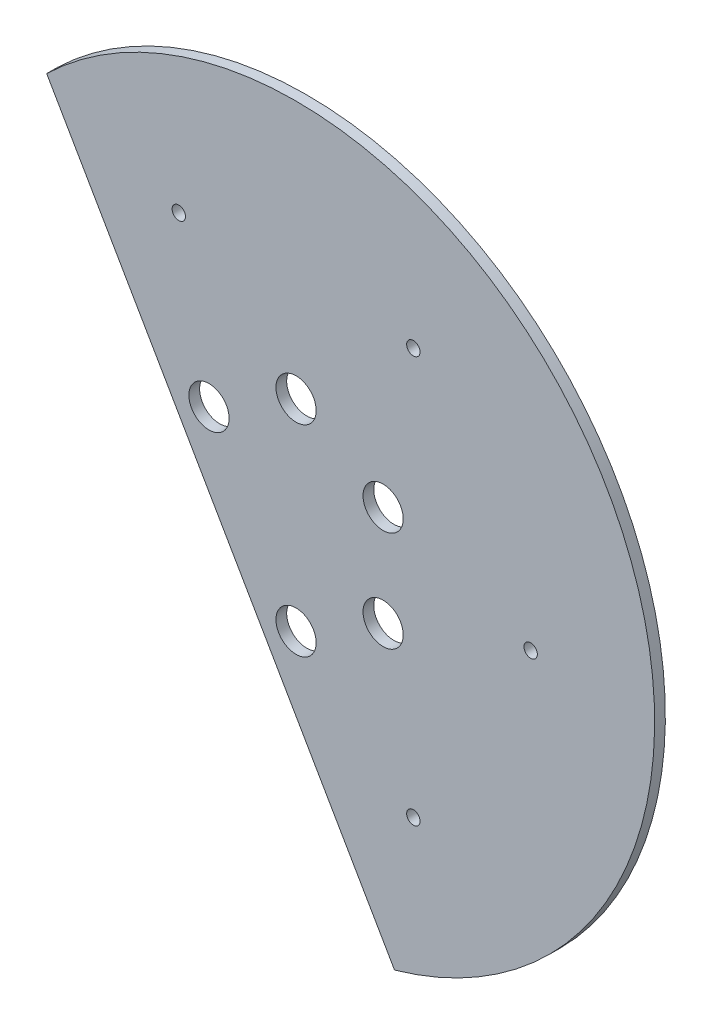
ISO-10303-21;
HEADER;
FILE_DESCRIPTION(('STEP AP214'),'2;1');
FILE_NAME('part.step','',(''),(''),'','','');
FILE_SCHEMA(('AUTOMOTIVE_DESIGN { 1 0 10303 214 1 1 1 1 }'));
ENDSEC;
DATA;
#1=APPLICATION_CONTEXT('core data for automotive mechanical design processes');
#2=APPLICATION_PROTOCOL_DEFINITION('international standard','automotive_design',2000,#1);
#3=PRODUCT_CONTEXT('',#1,'mechanical');
#4=PRODUCT('Part','Part','',(#3));
#5=PRODUCT_RELATED_PRODUCT_CATEGORY('part','',(#4));
#6=PRODUCT_DEFINITION_FORMATION('','',#4);
#7=PRODUCT_DEFINITION_CONTEXT('part definition',#1,'design');
#8=PRODUCT_DEFINITION('design','',#6,#7);
#9=PRODUCT_DEFINITION_SHAPE('','',#8);
#10=(LENGTH_UNIT() NAMED_UNIT(*) SI_UNIT(.MILLI.,.METRE.));
#11=(NAMED_UNIT(*) PLANE_ANGLE_UNIT() SI_UNIT($,.RADIAN.));
#12=(NAMED_UNIT(*) SI_UNIT($,.STERADIAN.) SOLID_ANGLE_UNIT());
#13=UNCERTAINTY_MEASURE_WITH_UNIT(LENGTH_MEASURE(1.E-05),#10,'distance_accuracy_value','');
#14=(GEOMETRIC_REPRESENTATION_CONTEXT(3) GLOBAL_UNCERTAINTY_ASSIGNED_CONTEXT((#13)) GLOBAL_UNIT_ASSIGNED_CONTEXT((#10,
#11,#12)) REPRESENTATION_CONTEXT('',''));
#15=CARTESIAN_POINT('',(0.,0.,0.));
#16=DIRECTION('',(0.,0.,1.));
#17=DIRECTION('',(1.,0.,0.));
#18=AXIS2_PLACEMENT_3D('',#15,#16,#17);
#19=CARTESIAN_POINT('',(0.,0.,1.6));
#20=DIRECTION('',(0.,0.,1.));
#21=DIRECTION('',(1.,0.,0.));
#22=AXIS2_PLACEMENT_3D('',#19,#20,#21);
#23=PLANE('',#22);
#24=DIRECTION('',(-0.5,0.866025403784439,0.));
#25=VECTOR('',#24,1.);
#26=CARTESIAN_POINT('',(-37.206596087207,38.4437147997359,1.6));
#27=LINE('',#26,#25);
#28=CARTESIAN_POINT('',(14.6899355888116,-51.4437147997359,1.6));
#29=VERTEX_POINT('',#28);
#30=CARTESIAN_POINT('',(-37.206596087207,38.4437147997359,1.6));
#31=VERTEX_POINT('',#30);
#32=EDGE_CURVE('E53',#29,#31,#27,.T.);
#33=ORIENTED_EDGE('',*,*,#32,.F.);
#34=CARTESIAN_POINT('',(0.,0.,1.6));
#35=DIRECTION('',(0.,0.,1.));
#36=DIRECTION('',(1.,0.,0.));
#37=AXIS2_PLACEMENT_3D('',#34,#35,#36);
#38=CIRCLE('',#37,53.5);
#39=EDGE_CURVE('E11',#29,#31,#38,.T.);
#40=ORIENTED_EDGE('',*,*,#39,.T.);
#41=EDGE_LOOP('',(#33,#40));
#42=FACE_BOUND('',#41,.T.);
#43=CARTESIAN_POINT('',(0.,15.,1.6));
#44=DIRECTION('',(0.,0.,1.));
#45=DIRECTION('',(1.,0.,0.));
#46=AXIS2_PLACEMENT_3D('',#43,#44,#45);
#47=CIRCLE('',#46,3.);
#48=CARTESIAN_POINT('',(3.,15.,1.6));
#49=VERTEX_POINT('',#48);
#50=EDGE_CURVE('E84',#49,#49,#47,.T.);
#51=ORIENTED_EDGE('',*,*,#50,.F.);
#52=EDGE_LOOP('',(#51));
#53=FACE_BOUND('',#52,.T.);
#54=CARTESIAN_POINT('',(12.9903810567666,-7.5,1.6));
#55=DIRECTION('',(0.,0.,1.));
#56=DIRECTION('',(1.,0.,0.));
#57=AXIS2_PLACEMENT_3D('',#54,#55,#56);
#58=CIRCLE('',#57,3.);
#59=CARTESIAN_POINT('',(15.9903810567666,-7.5,1.6));
#60=VERTEX_POINT('',#59);
#61=EDGE_CURVE('E96',#60,#60,#58,.T.);
#62=ORIENTED_EDGE('',*,*,#61,.F.);
#63=EDGE_LOOP('',(#62));
#64=FACE_BOUND('',#63,.T.);
#65=CARTESIAN_POINT('',(17.5000000000002,30.3108891324552,1.6));
#66=DIRECTION('',(0.,0.,1.));
#67=DIRECTION('',(1.,0.,0.));
#68=AXIS2_PLACEMENT_3D('',#65,#66,#67);
#69=CIRCLE('',#68,1.);
#70=CARTESIAN_POINT('',(18.5000000000002,30.3108891324552,1.6));
#71=VERTEX_POINT('',#70);
#72=EDGE_CURVE('E108',#71,#71,#69,.T.);
#73=ORIENTED_EDGE('',*,*,#72,.F.);
#74=EDGE_LOOP('',(#73));
#75=FACE_BOUND('',#74,.T.);
#76=CARTESIAN_POINT('',(17.4999999999998,-30.3108891324555,1.6));
#77=DIRECTION('',(0.,0.,1.));
#78=DIRECTION('',(1.,0.,0.));
#79=AXIS2_PLACEMENT_3D('',#76,#77,#78);
#80=CIRCLE('',#79,1.);
#81=CARTESIAN_POINT('',(18.4999999999998,-30.3108891324555,1.6));
#82=VERTEX_POINT('',#81);
#83=EDGE_CURVE('E120',#82,#82,#80,.T.);
#84=ORIENTED_EDGE('',*,*,#83,.F.);
#85=EDGE_LOOP('',(#84));
#86=FACE_BOUND('',#85,.T.);
#87=CARTESIAN_POINT('',(35.,-2.40934246767076E-13,1.6));
#88=DIRECTION('',(0.,0.,1.));
#89=DIRECTION('',(1.,0.,0.));
#90=AXIS2_PLACEMENT_3D('',#87,#88,#89);
#91=CIRCLE('',#90,0.999999999999998);
#92=CARTESIAN_POINT('',(36.,-2.40934246767076E-13,1.6));
#93=VERTEX_POINT('',#92);
#94=EDGE_CURVE('E126',#93,#93,#91,.T.);
#95=ORIENTED_EDGE('',*,*,#94,.F.);
#96=EDGE_LOOP('',(#95));
#97=FACE_BOUND('',#96,.T.);
#98=CARTESIAN_POINT('',(-17.4999999999998,30.3108891324555,1.6));
#99=DIRECTION('',(0.,0.,1.));
#100=DIRECTION('',(1.,0.,0.));
#101=AXIS2_PLACEMENT_3D('',#98,#99,#100);
#102=CIRCLE('',#101,1.);
#103=CARTESIAN_POINT('',(-16.4999999999998,30.3108891324555,1.6));
#104=VERTEX_POINT('',#103);
#105=EDGE_CURVE('E114',#104,#104,#102,.T.);
#106=ORIENTED_EDGE('',*,*,#105,.F.);
#107=EDGE_LOOP('',(#106));
#108=FACE_BOUND('',#107,.T.);
#109=CARTESIAN_POINT('',(0.,-15.,1.6));
#110=DIRECTION('',(0.,0.,1.));
#111=DIRECTION('',(1.,0.,0.));
#112=AXIS2_PLACEMENT_3D('',#109,#110,#111);
#113=CIRCLE('',#112,3.);
#114=CARTESIAN_POINT('',(3.,-15.,1.6));
#115=VERTEX_POINT('',#114);
#116=EDGE_CURVE('E102',#115,#115,#113,.T.);
#117=ORIENTED_EDGE('',*,*,#116,.F.);
#118=EDGE_LOOP('',(#117));
#119=FACE_BOUND('',#118,.T.);
#120=CARTESIAN_POINT('',(12.9903810567666,7.5,1.6));
#121=DIRECTION('',(0.,0.,1.));
#122=DIRECTION('',(1.,0.,0.));
#123=AXIS2_PLACEMENT_3D('',#120,#121,#122);
#124=CIRCLE('',#123,3.);
#125=CARTESIAN_POINT('',(15.9903810567666,7.5,1.6));
#126=VERTEX_POINT('',#125);
#127=EDGE_CURVE('E90',#126,#126,#124,.T.);
#128=ORIENTED_EDGE('',*,*,#127,.F.);
#129=EDGE_LOOP('',(#128));
#130=FACE_BOUND('',#129,.T.);
#131=CARTESIAN_POINT('',(-12.9903810567666,7.50000000000001,1.6));
#132=DIRECTION('',(0.,0.,1.));
#133=DIRECTION('',(1.,0.,0.));
#134=AXIS2_PLACEMENT_3D('',#131,#132,#133);
#135=CIRCLE('',#134,3.);
#136=CARTESIAN_POINT('',(-9.99038105676657,7.50000000000001,1.6));
#137=VERTEX_POINT('',#136);
#138=EDGE_CURVE('E77',#137,#137,#135,.T.);
#139=ORIENTED_EDGE('',*,*,#138,.F.);
#140=EDGE_LOOP('',(#139));
#141=FACE_BOUND('',#140,.T.);
#142=ADVANCED_FACE('F38',(#42,#53,#64,#75,#86,#97,#108,#119,#130,#141),#23,.T.);
#143=CARTESIAN_POINT('',(0.,0.,0.));
#144=DIRECTION('',(0.,0.,1.));
#145=DIRECTION('',(1.,0.,0.));
#146=AXIS2_PLACEMENT_3D('',#143,#144,#145);
#147=PLANE('',#146);
#148=CARTESIAN_POINT('',(0.,0.,0.));
#149=DIRECTION('',(0.,0.,1.));
#150=DIRECTION('',(1.,0.,0.));
#151=AXIS2_PLACEMENT_3D('',#148,#149,#150);
#152=CIRCLE('',#151,53.5);
#153=CARTESIAN_POINT('',(14.6899355888116,-51.4437147997359,0.));
#154=VERTEX_POINT('',#153);
#155=CARTESIAN_POINT('',(-37.206596087207,38.4437147997359,0.));
#156=VERTEX_POINT('',#155);
#157=EDGE_CURVE('E42',#154,#156,#152,.T.);
#158=ORIENTED_EDGE('',*,*,#157,.F.);
#159=DIRECTION('',(-0.5,0.866025403784439,0.));
#160=VECTOR('',#159,1.);
#161=CARTESIAN_POINT('',(-37.206596087207,38.4437147997359,0.));
#162=LINE('',#161,#160);
#163=EDGE_CURVE('E65',#154,#156,#162,.T.);
#164=ORIENTED_EDGE('',*,*,#163,.T.);
#165=EDGE_LOOP('',(#158,#164));
#166=FACE_BOUND('',#165,.T.);
#167=CARTESIAN_POINT('',(35.,-2.40934246767076E-13,0.));
#168=DIRECTION('',(0.,0.,1.));
#169=DIRECTION('',(1.,0.,0.));
#170=AXIS2_PLACEMENT_3D('',#167,#168,#169);
#171=CIRCLE('',#170,0.999999999999998);
#172=CARTESIAN_POINT('',(36.,-2.40934246767076E-13,0.));
#173=VERTEX_POINT('',#172);
#174=EDGE_CURVE('E123',#173,#173,#171,.T.);
#175=ORIENTED_EDGE('',*,*,#174,.T.);
#176=EDGE_LOOP('',(#175));
#177=FACE_BOUND('',#176,.T.);
#178=CARTESIAN_POINT('',(17.4999999999998,-30.3108891324555,0.));
#179=DIRECTION('',(0.,0.,1.));
#180=DIRECTION('',(1.,0.,0.));
#181=AXIS2_PLACEMENT_3D('',#178,#179,#180);
#182=CIRCLE('',#181,1.);
#183=CARTESIAN_POINT('',(18.4999999999998,-30.3108891324555,0.));
#184=VERTEX_POINT('',#183);
#185=EDGE_CURVE('E117',#184,#184,#182,.T.);
#186=ORIENTED_EDGE('',*,*,#185,.T.);
#187=EDGE_LOOP('',(#186));
#188=FACE_BOUND('',#187,.T.);
#189=CARTESIAN_POINT('',(-17.4999999999998,30.3108891324555,0.));
#190=DIRECTION('',(0.,0.,1.));
#191=DIRECTION('',(1.,0.,0.));
#192=AXIS2_PLACEMENT_3D('',#189,#190,#191);
#193=CIRCLE('',#192,1.);
#194=CARTESIAN_POINT('',(-16.4999999999998,30.3108891324555,0.));
#195=VERTEX_POINT('',#194);
#196=EDGE_CURVE('E111',#195,#195,#193,.T.);
#197=ORIENTED_EDGE('',*,*,#196,.T.);
#198=EDGE_LOOP('',(#197));
#199=FACE_BOUND('',#198,.T.);
#200=CARTESIAN_POINT('',(17.5000000000002,30.3108891324552,0.));
#201=DIRECTION('',(0.,0.,1.));
#202=DIRECTION('',(1.,0.,0.));
#203=AXIS2_PLACEMENT_3D('',#200,#201,#202);
#204=CIRCLE('',#203,1.);
#205=CARTESIAN_POINT('',(18.5000000000002,30.3108891324552,0.));
#206=VERTEX_POINT('',#205);
#207=EDGE_CURVE('E105',#206,#206,#204,.T.);
#208=ORIENTED_EDGE('',*,*,#207,.T.);
#209=EDGE_LOOP('',(#208));
#210=FACE_BOUND('',#209,.T.);
#211=CARTESIAN_POINT('',(0.,-15.,0.));
#212=DIRECTION('',(0.,0.,1.));
#213=DIRECTION('',(1.,0.,0.));
#214=AXIS2_PLACEMENT_3D('',#211,#212,#213);
#215=CIRCLE('',#214,3.);
#216=CARTESIAN_POINT('',(3.,-15.,0.));
#217=VERTEX_POINT('',#216);
#218=EDGE_CURVE('E99',#217,#217,#215,.T.);
#219=ORIENTED_EDGE('',*,*,#218,.T.);
#220=EDGE_LOOP('',(#219));
#221=FACE_BOUND('',#220,.T.);
#222=CARTESIAN_POINT('',(12.9903810567666,-7.5,0.));
#223=DIRECTION('',(0.,0.,1.));
#224=DIRECTION('',(1.,0.,0.));
#225=AXIS2_PLACEMENT_3D('',#222,#223,#224);
#226=CIRCLE('',#225,3.);
#227=CARTESIAN_POINT('',(15.9903810567666,-7.5,0.));
#228=VERTEX_POINT('',#227);
#229=EDGE_CURVE('E93',#228,#228,#226,.T.);
#230=ORIENTED_EDGE('',*,*,#229,.T.);
#231=EDGE_LOOP('',(#230));
#232=FACE_BOUND('',#231,.T.);
#233=CARTESIAN_POINT('',(12.9903810567666,7.5,0.));
#234=DIRECTION('',(0.,0.,1.));
#235=DIRECTION('',(1.,0.,0.));
#236=AXIS2_PLACEMENT_3D('',#233,#234,#235);
#237=CIRCLE('',#236,3.);
#238=CARTESIAN_POINT('',(15.9903810567666,7.5,0.));
#239=VERTEX_POINT('',#238);
#240=EDGE_CURVE('E87',#239,#239,#237,.T.);
#241=ORIENTED_EDGE('',*,*,#240,.T.);
#242=EDGE_LOOP('',(#241));
#243=FACE_BOUND('',#242,.T.);
#244=CARTESIAN_POINT('',(0.,15.,0.));
#245=DIRECTION('',(0.,0.,1.));
#246=DIRECTION('',(1.,0.,0.));
#247=AXIS2_PLACEMENT_3D('',#244,#245,#246);
#248=CIRCLE('',#247,3.);
#249=CARTESIAN_POINT('',(3.,15.,0.));
#250=VERTEX_POINT('',#249);
#251=EDGE_CURVE('E82',#250,#250,#248,.T.);
#252=ORIENTED_EDGE('',*,*,#251,.T.);
#253=EDGE_LOOP('',(#252));
#254=FACE_BOUND('',#253,.T.);
#255=CARTESIAN_POINT('',(-12.9903810567666,7.50000000000001,0.));
#256=DIRECTION('',(0.,0.,1.));
#257=DIRECTION('',(1.,0.,0.));
#258=AXIS2_PLACEMENT_3D('',#255,#256,#257);
#259=CIRCLE('',#258,3.);
#260=CARTESIAN_POINT('',(-9.99038105676657,7.50000000000001,0.));
#261=VERTEX_POINT('',#260);
#262=EDGE_CURVE('E74',#261,#261,#259,.T.);
#263=ORIENTED_EDGE('',*,*,#262,.T.);
#264=EDGE_LOOP('',(#263));
#265=FACE_BOUND('',#264,.T.);
#266=ADVANCED_FACE('F132',(#166,#177,#188,#199,#210,#221,#232,#243,#254,#265),#147,.F.);
#267=CARTESIAN_POINT('',(0.,0.,1.6));
#268=DIRECTION('',(0.,0.,-1.));
#269=DIRECTION('',(-1.,0.,0.));
#270=AXIS2_PLACEMENT_3D('',#267,#268,#269);
#271=CYLINDRICAL_SURFACE('',#270,53.5);
#272=ORIENTED_EDGE('',*,*,#39,.F.);
#273=DIRECTION('',(0.,0.,1.));
#274=VECTOR('',#273,1.);
#275=CARTESIAN_POINT('',(14.6899355888116,-51.4437147997359,0.));
#276=LINE('',#275,#274);
#277=EDGE_CURVE('E63',#154,#29,#276,.T.);
#278=ORIENTED_EDGE('',*,*,#277,.F.);
#279=ORIENTED_EDGE('',*,*,#157,.T.);
#280=DIRECTION('',(0.,0.,1.));
#281=VECTOR('',#280,1.);
#282=CARTESIAN_POINT('',(-37.206596087207,38.4437147997359,0.));
#283=LINE('',#282,#281);
#284=EDGE_CURVE('E58',#156,#31,#283,.T.);
#285=ORIENTED_EDGE('',*,*,#284,.T.);
#286=EDGE_LOOP('',(#272,#278,#279,#285));
#287=FACE_BOUND('',#286,.T.);
#288=ADVANCED_FACE('F40',(#287),#271,.T.);
#289=CARTESIAN_POINT('',(35.,-2.40934246767076E-13,1.6));
#290=DIRECTION('',(0.,0.,-1.));
#291=DIRECTION('',(-1.,0.,0.));
#292=AXIS2_PLACEMENT_3D('',#289,#290,#291);
#293=CYLINDRICAL_SURFACE('',#292,0.999999999999998);
#294=ORIENTED_EDGE('',*,*,#94,.T.);
#295=EDGE_LOOP('',(#294));
#296=FACE_BOUND('',#295,.T.);
#297=ORIENTED_EDGE('',*,*,#174,.F.);
#298=EDGE_LOOP('',(#297));
#299=FACE_BOUND('',#298,.T.);
#300=ADVANCED_FACE('F135',(#296,#299),#293,.F.);
#301=CARTESIAN_POINT('',(17.4999999999998,-30.3108891324555,1.6));
#302=DIRECTION('',(0.,0.,-1.));
#303=DIRECTION('',(-1.,0.,0.));
#304=AXIS2_PLACEMENT_3D('',#301,#302,#303);
#305=CYLINDRICAL_SURFACE('',#304,1.);
#306=ORIENTED_EDGE('',*,*,#83,.T.);
#307=EDGE_LOOP('',(#306));
#308=FACE_BOUND('',#307,.T.);
#309=ORIENTED_EDGE('',*,*,#185,.F.);
#310=EDGE_LOOP('',(#309));
#311=FACE_BOUND('',#310,.T.);
#312=ADVANCED_FACE('F137',(#308,#311),#305,.F.);
#313=CARTESIAN_POINT('',(-17.4999999999998,30.3108891324555,1.6));
#314=DIRECTION('',(0.,0.,-1.));
#315=DIRECTION('',(-1.,0.,0.));
#316=AXIS2_PLACEMENT_3D('',#313,#314,#315);
#317=CYLINDRICAL_SURFACE('',#316,1.);
#318=ORIENTED_EDGE('',*,*,#105,.T.);
#319=EDGE_LOOP('',(#318));
#320=FACE_BOUND('',#319,.T.);
#321=ORIENTED_EDGE('',*,*,#196,.F.);
#322=EDGE_LOOP('',(#321));
#323=FACE_BOUND('',#322,.T.);
#324=ADVANCED_FACE('F144',(#320,#323),#317,.F.);
#325=CARTESIAN_POINT('',(17.5000000000002,30.3108891324552,1.6));
#326=DIRECTION('',(0.,0.,-1.));
#327=DIRECTION('',(-1.,0.,0.));
#328=AXIS2_PLACEMENT_3D('',#325,#326,#327);
#329=CYLINDRICAL_SURFACE('',#328,1.);
#330=ORIENTED_EDGE('',*,*,#72,.T.);
#331=EDGE_LOOP('',(#330));
#332=FACE_BOUND('',#331,.T.);
#333=ORIENTED_EDGE('',*,*,#207,.F.);
#334=EDGE_LOOP('',(#333));
#335=FACE_BOUND('',#334,.T.);
#336=ADVANCED_FACE('F207',(#332,#335),#329,.F.);
#337=CARTESIAN_POINT('',(0.,-15.,1.6));
#338=DIRECTION('',(0.,0.,-1.));
#339=DIRECTION('',(-1.,0.,0.));
#340=AXIS2_PLACEMENT_3D('',#337,#338,#339);
#341=CYLINDRICAL_SURFACE('',#340,3.);
#342=ORIENTED_EDGE('',*,*,#116,.T.);
#343=EDGE_LOOP('',(#342));
#344=FACE_BOUND('',#343,.T.);
#345=ORIENTED_EDGE('',*,*,#218,.F.);
#346=EDGE_LOOP('',(#345));
#347=FACE_BOUND('',#346,.T.);
#348=ADVANCED_FACE('F199',(#344,#347),#341,.F.);
#349=CARTESIAN_POINT('',(12.9903810567666,-7.5,1.6));
#350=DIRECTION('',(0.,0.,-1.));
#351=DIRECTION('',(-1.,0.,0.));
#352=AXIS2_PLACEMENT_3D('',#349,#350,#351);
#353=CYLINDRICAL_SURFACE('',#352,3.);
#354=ORIENTED_EDGE('',*,*,#61,.T.);
#355=EDGE_LOOP('',(#354));
#356=FACE_BOUND('',#355,.T.);
#357=ORIENTED_EDGE('',*,*,#229,.F.);
#358=EDGE_LOOP('',(#357));
#359=FACE_BOUND('',#358,.T.);
#360=ADVANCED_FACE('F191',(#356,#359),#353,.F.);
#361=CARTESIAN_POINT('',(12.9903810567666,7.5,1.6));
#362=DIRECTION('',(0.,0.,-1.));
#363=DIRECTION('',(-1.,0.,0.));
#364=AXIS2_PLACEMENT_3D('',#361,#362,#363);
#365=CYLINDRICAL_SURFACE('',#364,3.);
#366=ORIENTED_EDGE('',*,*,#127,.T.);
#367=EDGE_LOOP('',(#366));
#368=FACE_BOUND('',#367,.T.);
#369=ORIENTED_EDGE('',*,*,#240,.F.);
#370=EDGE_LOOP('',(#369));
#371=FACE_BOUND('',#370,.T.);
#372=ADVANCED_FACE('F183',(#368,#371),#365,.F.);
#373=CARTESIAN_POINT('',(0.,15.,1.6));
#374=DIRECTION('',(0.,0.,-1.));
#375=DIRECTION('',(-1.,0.,0.));
#376=AXIS2_PLACEMENT_3D('',#373,#374,#375);
#377=CYLINDRICAL_SURFACE('',#376,3.);
#378=ORIENTED_EDGE('',*,*,#50,.T.);
#379=EDGE_LOOP('',(#378));
#380=FACE_BOUND('',#379,.T.);
#381=ORIENTED_EDGE('',*,*,#251,.F.);
#382=EDGE_LOOP('',(#381));
#383=FACE_BOUND('',#382,.T.);
#384=ADVANCED_FACE('F176',(#380,#383),#377,.F.);
#385=CARTESIAN_POINT('',(-12.9903810567666,7.50000000000001,1.6));
#386=DIRECTION('',(0.,0.,-1.));
#387=DIRECTION('',(-1.,0.,0.));
#388=AXIS2_PLACEMENT_3D('',#385,#386,#387);
#389=CYLINDRICAL_SURFACE('',#388,3.);
#390=ORIENTED_EDGE('',*,*,#138,.T.);
#391=EDGE_LOOP('',(#390));
#392=FACE_BOUND('',#391,.T.);
#393=ORIENTED_EDGE('',*,*,#262,.F.);
#394=EDGE_LOOP('',(#393));
#395=FACE_BOUND('',#394,.T.);
#396=ADVANCED_FACE('F166',(#392,#395),#389,.F.);
#397=CARTESIAN_POINT('',(-37.206596087207,38.4437147997359,0.));
#398=DIRECTION('',(0.866025403784439,0.5,0.));
#399=DIRECTION('',(-0.5,0.866025403784439,0.));
#400=AXIS2_PLACEMENT_3D('',#397,#398,#399);
#401=PLANE('',#400);
#402=ORIENTED_EDGE('',*,*,#32,.T.);
#403=ORIENTED_EDGE('',*,*,#284,.F.);
#404=ORIENTED_EDGE('',*,*,#163,.F.);
#405=ORIENTED_EDGE('',*,*,#277,.T.);
#406=EDGE_LOOP('',(#402,#403,#404,#405));
#407=FACE_BOUND('',#406,.T.);
#408=ADVANCED_FACE('F64',(#407),#401,.F.);
#409=CLOSED_SHELL('',(#142,#266,#288,#300,#312,#324,#336,#348,#360,#372,#384,#396,#408));
#410=MANIFOLD_SOLID_BREP('B2',#409);
#411=ADVANCED_BREP_SHAPE_REPRESENTATION('',(#18,#410),#14);
#412=SHAPE_DEFINITION_REPRESENTATION(#9,#411);
ENDSEC;
END-ISO-10303-21;
